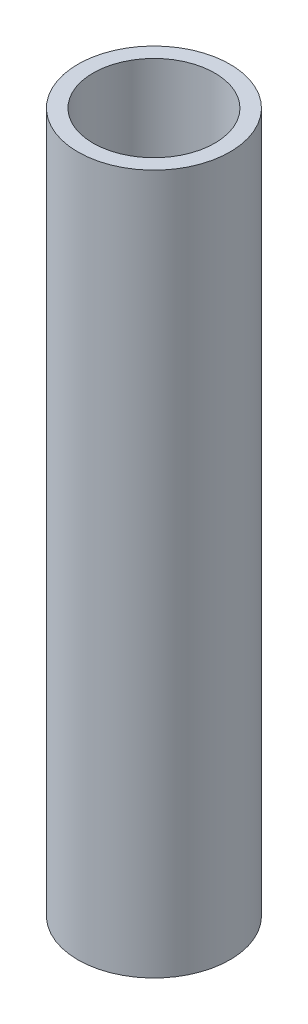
ISO-10303-21;
HEADER;
FILE_DESCRIPTION(('STEP AP214'),'2;1');
FILE_NAME('part.step','',(''),(''),'','','');
FILE_SCHEMA(('AUTOMOTIVE_DESIGN { 1 0 10303 214 1 1 1 1 }'));
ENDSEC;
DATA;
#1=APPLICATION_CONTEXT('core data for automotive mechanical design processes');
#2=APPLICATION_PROTOCOL_DEFINITION('international standard','automotive_design',2000,#1);
#3=PRODUCT_CONTEXT('',#1,'mechanical');
#4=PRODUCT('Part','Part','',(#3));
#5=PRODUCT_RELATED_PRODUCT_CATEGORY('part','',(#4));
#6=PRODUCT_DEFINITION_FORMATION('','',#4);
#7=PRODUCT_DEFINITION_CONTEXT('part definition',#1,'design');
#8=PRODUCT_DEFINITION('design','',#6,#7);
#9=PRODUCT_DEFINITION_SHAPE('','',#8);
#10=(LENGTH_UNIT() NAMED_UNIT(*) SI_UNIT(.MILLI.,.METRE.));
#11=(NAMED_UNIT(*) PLANE_ANGLE_UNIT() SI_UNIT($,.RADIAN.));
#12=(NAMED_UNIT(*) SI_UNIT($,.STERADIAN.) SOLID_ANGLE_UNIT());
#13=UNCERTAINTY_MEASURE_WITH_UNIT(LENGTH_MEASURE(1.E-05),#10,'distance_accuracy_value','');
#14=(GEOMETRIC_REPRESENTATION_CONTEXT(3) GLOBAL_UNCERTAINTY_ASSIGNED_CONTEXT((#13)) GLOBAL_UNIT_ASSIGNED_CONTEXT((#10,
#11,#12)) REPRESENTATION_CONTEXT('',''));
#15=CARTESIAN_POINT('',(0.,0.,0.));
#16=DIRECTION('',(0.,0.,1.));
#17=DIRECTION('',(1.,0.,0.));
#18=AXIS2_PLACEMENT_3D('',#15,#16,#17);
#19=CARTESIAN_POINT('',(0.,73.025,0.));
#20=DIRECTION('',(0.,1.,0.));
#21=DIRECTION('',(0.,0.,1.));
#22=AXIS2_PLACEMENT_3D('',#19,#20,#21);
#23=PLANE('',#22);
#24=CARTESIAN_POINT('',(0.,73.025,0.));
#25=DIRECTION('',(0.,1.,0.));
#26=DIRECTION('',(0.,0.,1.));
#27=AXIS2_PLACEMENT_3D('',#24,#25,#26);
#28=CIRCLE('',#27,15.875);
#29=CARTESIAN_POINT('',(0.,73.025,15.875));
#30=VERTEX_POINT('',#29);
#31=EDGE_CURVE('E10',#30,#30,#28,.T.);
#32=ORIENTED_EDGE('',*,*,#31,.T.);
#33=EDGE_LOOP('',(#32));
#34=FACE_BOUND('',#33,.T.);
#35=CARTESIAN_POINT('',(0.,73.025,0.));
#36=DIRECTION('',(0.,1.,0.));
#37=DIRECTION('',(0.,0.,1.));
#38=AXIS2_PLACEMENT_3D('',#35,#36,#37);
#39=CIRCLE('',#38,12.7);
#40=CARTESIAN_POINT('',(0.,73.025,12.7));
#41=VERTEX_POINT('',#40);
#42=EDGE_CURVE('E42',#41,#41,#39,.T.);
#43=ORIENTED_EDGE('',*,*,#42,.F.);
#44=EDGE_LOOP('',(#43));
#45=FACE_BOUND('',#44,.T.);
#46=ADVANCED_FACE('F31',(#34,#45),#23,.T.);
#47=CARTESIAN_POINT('',(0.,-73.025,0.));
#48=DIRECTION('',(0.,1.,0.));
#49=DIRECTION('',(0.,0.,1.));
#50=AXIS2_PLACEMENT_3D('',#47,#48,#49);
#51=PLANE('',#50);
#52=CARTESIAN_POINT('',(0.,-73.025,0.));
#53=DIRECTION('',(0.,1.,0.));
#54=DIRECTION('',(0.,0.,1.));
#55=AXIS2_PLACEMENT_3D('',#52,#53,#54);
#56=CIRCLE('',#55,15.875);
#57=CARTESIAN_POINT('',(0.,-73.025,15.875));
#58=VERTEX_POINT('',#57);
#59=EDGE_CURVE('E35',#58,#58,#56,.T.);
#60=ORIENTED_EDGE('',*,*,#59,.F.);
#61=EDGE_LOOP('',(#60));
#62=FACE_BOUND('',#61,.T.);
#63=CARTESIAN_POINT('',(0.,-73.025,0.));
#64=DIRECTION('',(0.,1.,0.));
#65=DIRECTION('',(0.,0.,1.));
#66=AXIS2_PLACEMENT_3D('',#63,#64,#65);
#67=CIRCLE('',#66,12.7);
#68=CARTESIAN_POINT('',(0.,-73.025,12.7));
#69=VERTEX_POINT('',#68);
#70=EDGE_CURVE('E44',#69,#69,#67,.T.);
#71=ORIENTED_EDGE('',*,*,#70,.T.);
#72=EDGE_LOOP('',(#71));
#73=FACE_BOUND('',#72,.T.);
#74=ADVANCED_FACE('F54',(#62,#73),#51,.F.);
#75=CARTESIAN_POINT('',(0.,73.025,0.));
#76=DIRECTION('',(0.,-1.,0.));
#77=DIRECTION('',(0.,0.,-1.));
#78=AXIS2_PLACEMENT_3D('',#75,#76,#77);
#79=CYLINDRICAL_SURFACE('',#78,15.875);
#80=ORIENTED_EDGE('',*,*,#31,.F.);
#81=EDGE_LOOP('',(#80));
#82=FACE_BOUND('',#81,.T.);
#83=ORIENTED_EDGE('',*,*,#59,.T.);
#84=EDGE_LOOP('',(#83));
#85=FACE_BOUND('',#84,.T.);
#86=ADVANCED_FACE('F33',(#82,#85),#79,.T.);
#87=CARTESIAN_POINT('',(0.,73.025,0.));
#88=DIRECTION('',(0.,-1.,0.));
#89=DIRECTION('',(0.,0.,-1.));
#90=AXIS2_PLACEMENT_3D('',#87,#88,#89);
#91=CYLINDRICAL_SURFACE('',#90,12.7);
#92=ORIENTED_EDGE('',*,*,#42,.T.);
#93=EDGE_LOOP('',(#92));
#94=FACE_BOUND('',#93,.T.);
#95=ORIENTED_EDGE('',*,*,#70,.F.);
#96=EDGE_LOOP('',(#95));
#97=FACE_BOUND('',#96,.T.);
#98=ADVANCED_FACE('F50',(#94,#97),#91,.F.);
#99=CLOSED_SHELL('',(#46,#74,#86,#98));
#100=MANIFOLD_SOLID_BREP('B2',#99);
#101=ADVANCED_BREP_SHAPE_REPRESENTATION('',(#18,#100),#14);
#102=SHAPE_DEFINITION_REPRESENTATION(#9,#101);
ENDSEC;
END-ISO-10303-21;
